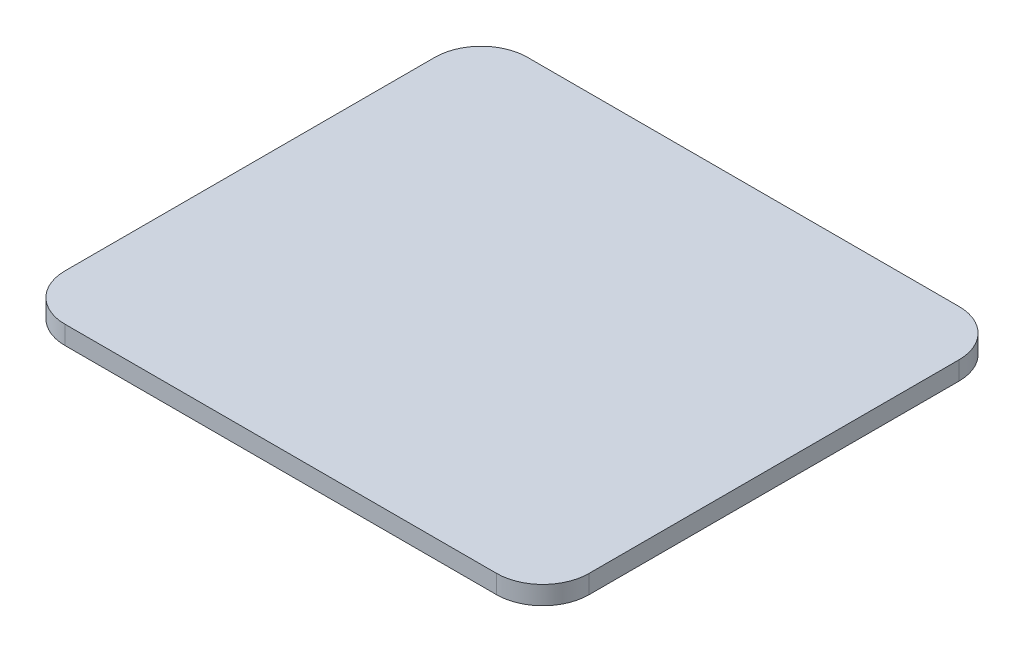
ISO-10303-21;
HEADER;
FILE_DESCRIPTION(('STEP AP214'),'2;1');
FILE_NAME('part.step','',(''),(''),'','','');
FILE_SCHEMA(('AUTOMOTIVE_DESIGN { 1 0 10303 214 1 1 1 1 }'));
ENDSEC;
DATA;
#1=APPLICATION_CONTEXT('core data for automotive mechanical design processes');
#2=APPLICATION_PROTOCOL_DEFINITION('international standard','automotive_design',2000,#1);
#3=PRODUCT_CONTEXT('',#1,'mechanical');
#4=PRODUCT('Part','Part','',(#3));
#5=PRODUCT_RELATED_PRODUCT_CATEGORY('part','',(#4));
#6=PRODUCT_DEFINITION_FORMATION('','',#4);
#7=PRODUCT_DEFINITION_CONTEXT('part definition',#1,'design');
#8=PRODUCT_DEFINITION('design','',#6,#7);
#9=PRODUCT_DEFINITION_SHAPE('','',#8);
#10=(LENGTH_UNIT() NAMED_UNIT(*) SI_UNIT(.MILLI.,.METRE.));
#11=(NAMED_UNIT(*) PLANE_ANGLE_UNIT() SI_UNIT($,.RADIAN.));
#12=(NAMED_UNIT(*) SI_UNIT($,.STERADIAN.) SOLID_ANGLE_UNIT());
#13=UNCERTAINTY_MEASURE_WITH_UNIT(LENGTH_MEASURE(1.E-05),#10,'distance_accuracy_value','');
#14=(GEOMETRIC_REPRESENTATION_CONTEXT(3) GLOBAL_UNCERTAINTY_ASSIGNED_CONTEXT((#13)) GLOBAL_UNIT_ASSIGNED_CONTEXT((#10,
#11,#12)) REPRESENTATION_CONTEXT('',''));
#15=CARTESIAN_POINT('',(0.,0.,0.));
#16=DIRECTION('',(0.,0.,1.));
#17=DIRECTION('',(1.,0.,0.));
#18=AXIS2_PLACEMENT_3D('',#15,#16,#17);
#19=CARTESIAN_POINT('',(170.,12.,150.));
#20=DIRECTION('',(-1.,0.,0.));
#21=DIRECTION('',(0.,0.,1.));
#22=AXIS2_PLACEMENT_3D('',#19,#20,#21);
#23=PLANE('',#22);
#24=DIRECTION('',(0.,0.,-1.));
#25=VECTOR('',#24,1.);
#26=CARTESIAN_POINT('',(170.,0.,150.));
#27=LINE('',#26,#25);
#28=CARTESIAN_POINT('',(170.,0.,120.));
#29=VERTEX_POINT('',#28);
#30=CARTESIAN_POINT('',(170.,0.,-120.));
#31=VERTEX_POINT('',#30);
#32=EDGE_CURVE('E129',#29,#31,#27,.T.);
#33=ORIENTED_EDGE('',*,*,#32,.T.);
#34=DIRECTION('',(0.,-1.,0.));
#35=VECTOR('',#34,1.);
#36=CARTESIAN_POINT('',(170.,12.,-120.));
#37=LINE('',#36,#35);
#38=CARTESIAN_POINT('',(170.,12.,-120.));
#39=VERTEX_POINT('',#38);
#40=EDGE_CURVE('E152',#31,#39,#37,.F.);
#41=ORIENTED_EDGE('',*,*,#40,.T.);
#42=DIRECTION('',(0.,0.,-1.));
#43=VECTOR('',#42,1.);
#44=CARTESIAN_POINT('',(170.,12.,150.));
#45=LINE('',#44,#43);
#46=CARTESIAN_POINT('',(170.,12.,120.));
#47=VERTEX_POINT('',#46);
#48=EDGE_CURVE('E127',#47,#39,#45,.T.);
#49=ORIENTED_EDGE('',*,*,#48,.F.);
#50=DIRECTION('',(0.,-1.,0.));
#51=VECTOR('',#50,1.);
#52=CARTESIAN_POINT('',(170.,12.,120.));
#53=LINE('',#52,#51);
#54=EDGE_CURVE('E149',#47,#29,#53,.T.);
#55=ORIENTED_EDGE('',*,*,#54,.T.);
#56=EDGE_LOOP('',(#33,#41,#49,#55));
#57=FACE_BOUND('',#56,.T.);
#58=ADVANCED_FACE('F34',(#57),#23,.F.);
#59=CARTESIAN_POINT('',(-170.,12.,-150.));
#60=DIRECTION('',(0.,0.,1.));
#61=DIRECTION('',(1.,0.,0.));
#62=AXIS2_PLACEMENT_3D('',#59,#60,#61);
#63=PLANE('',#62);
#64=DIRECTION('',(-1.,0.,0.));
#65=VECTOR('',#64,1.);
#66=CARTESIAN_POINT('',(-170.,0.,-150.));
#67=LINE('',#66,#65);
#68=CARTESIAN_POINT('',(140.,0.,-150.));
#69=VERTEX_POINT('',#68);
#70=CARTESIAN_POINT('',(-140.,0.,-150.));
#71=VERTEX_POINT('',#70);
#72=EDGE_CURVE('E125',#69,#71,#67,.T.);
#73=ORIENTED_EDGE('',*,*,#72,.T.);
#74=DIRECTION('',(0.,-1.,0.));
#75=VECTOR('',#74,1.);
#76=CARTESIAN_POINT('',(-140.,12.,-150.));
#77=LINE('',#76,#75);
#78=CARTESIAN_POINT('',(-140.,12.,-150.));
#79=VERTEX_POINT('',#78);
#80=EDGE_CURVE('E104',#71,#79,#77,.F.);
#81=ORIENTED_EDGE('',*,*,#80,.T.);
#82=DIRECTION('',(-1.,0.,0.));
#83=VECTOR('',#82,1.);
#84=CARTESIAN_POINT('',(-170.,12.,-150.));
#85=LINE('',#84,#83);
#86=CARTESIAN_POINT('',(140.,12.,-150.));
#87=VERTEX_POINT('',#86);
#88=EDGE_CURVE('E168',#87,#79,#85,.T.);
#89=ORIENTED_EDGE('',*,*,#88,.F.);
#90=DIRECTION('',(0.,-1.,0.));
#91=VECTOR('',#90,1.);
#92=CARTESIAN_POINT('',(140.,12.,-150.));
#93=LINE('',#92,#91);
#94=EDGE_CURVE('E109',#87,#69,#93,.T.);
#95=ORIENTED_EDGE('',*,*,#94,.T.);
#96=EDGE_LOOP('',(#73,#81,#89,#95));
#97=FACE_BOUND('',#96,.T.);
#98=ADVANCED_FACE('F185',(#97),#63,.F.);
#99=CARTESIAN_POINT('',(-170.,12.,150.));
#100=DIRECTION('',(1.,0.,0.));
#101=DIRECTION('',(0.,0.,-1.));
#102=AXIS2_PLACEMENT_3D('',#99,#100,#101);
#103=PLANE('',#102);
#104=DIRECTION('',(0.,0.,1.));
#105=VECTOR('',#104,1.);
#106=CARTESIAN_POINT('',(-170.,12.,150.));
#107=LINE('',#106,#105);
#108=CARTESIAN_POINT('',(-170.,12.,-120.));
#109=VERTEX_POINT('',#108);
#110=CARTESIAN_POINT('',(-170.,12.,120.));
#111=VERTEX_POINT('',#110);
#112=EDGE_CURVE('E118',#109,#111,#107,.T.);
#113=ORIENTED_EDGE('',*,*,#112,.F.);
#114=DIRECTION('',(0.,-1.,0.));
#115=VECTOR('',#114,1.);
#116=CARTESIAN_POINT('',(-170.,12.,-120.));
#117=LINE('',#116,#115);
#118=CARTESIAN_POINT('',(-170.,0.,-120.));
#119=VERTEX_POINT('',#118);
#120=EDGE_CURVE('E103',#109,#119,#117,.T.);
#121=ORIENTED_EDGE('',*,*,#120,.T.);
#122=DIRECTION('',(0.,0.,1.));
#123=VECTOR('',#122,1.);
#124=CARTESIAN_POINT('',(-170.,0.,150.));
#125=LINE('',#124,#123);
#126=CARTESIAN_POINT('',(-170.,0.,120.));
#127=VERTEX_POINT('',#126);
#128=EDGE_CURVE('E116',#119,#127,#125,.T.);
#129=ORIENTED_EDGE('',*,*,#128,.T.);
#130=DIRECTION('',(0.,-1.,0.));
#131=VECTOR('',#130,1.);
#132=CARTESIAN_POINT('',(-170.,12.,120.));
#133=LINE('',#132,#131);
#134=EDGE_CURVE('E120',#127,#111,#133,.F.);
#135=ORIENTED_EDGE('',*,*,#134,.T.);
#136=EDGE_LOOP('',(#113,#121,#129,#135));
#137=FACE_BOUND('',#136,.T.);
#138=ADVANCED_FACE('F115',(#137),#103,.F.);
#139=CARTESIAN_POINT('',(-170.,12.,150.));
#140=DIRECTION('',(0.,0.,-1.));
#141=DIRECTION('',(-1.,0.,0.));
#142=AXIS2_PLACEMENT_3D('',#139,#140,#141);
#143=PLANE('',#142);
#144=DIRECTION('',(1.,0.,0.));
#145=VECTOR('',#144,1.);
#146=CARTESIAN_POINT('',(-170.,0.,150.));
#147=LINE('',#146,#145);
#148=CARTESIAN_POINT('',(-140.,0.,150.));
#149=VERTEX_POINT('',#148);
#150=CARTESIAN_POINT('',(140.,0.,150.));
#151=VERTEX_POINT('',#150);
#152=EDGE_CURVE('E124',#149,#151,#147,.T.);
#153=ORIENTED_EDGE('',*,*,#152,.T.);
#154=DIRECTION('',(0.,-1.,0.));
#155=VECTOR('',#154,1.);
#156=CARTESIAN_POINT('',(140.,12.,150.));
#157=LINE('',#156,#155);
#158=CARTESIAN_POINT('',(140.,12.,150.));
#159=VERTEX_POINT('',#158);
#160=EDGE_CURVE('E11',#151,#159,#157,.F.);
#161=ORIENTED_EDGE('',*,*,#160,.T.);
#162=DIRECTION('',(1.,0.,0.));
#163=VECTOR('',#162,1.);
#164=CARTESIAN_POINT('',(-170.,12.,150.));
#165=LINE('',#164,#163);
#166=CARTESIAN_POINT('',(-140.,12.,150.));
#167=VERTEX_POINT('',#166);
#168=EDGE_CURVE('E133',#167,#159,#165,.T.);
#169=ORIENTED_EDGE('',*,*,#168,.F.);
#170=DIRECTION('',(0.,-1.,0.));
#171=VECTOR('',#170,1.);
#172=CARTESIAN_POINT('',(-140.,12.,150.));
#173=LINE('',#172,#171);
#174=EDGE_CURVE('E42',#167,#149,#173,.T.);
#175=ORIENTED_EDGE('',*,*,#174,.T.);
#176=EDGE_LOOP('',(#153,#161,#169,#175));
#177=FACE_BOUND('',#176,.T.);
#178=ADVANCED_FACE('F155',(#177),#143,.F.);
#179=CARTESIAN_POINT('',(0.,12.,0.));
#180=DIRECTION('',(0.,-1.,0.));
#181=DIRECTION('',(0.,0.,-1.));
#182=AXIS2_PLACEMENT_3D('',#179,#180,#181);
#183=PLANE('',#182);
#184=ORIENTED_EDGE('',*,*,#88,.T.);
#185=CARTESIAN_POINT('',(-140.,12.,-120.));
#186=DIRECTION('',(0.,-1.,0.));
#187=DIRECTION('',(0.,0.,-1.));
#188=AXIS2_PLACEMENT_3D('',#185,#186,#187);
#189=CIRCLE('',#188,30.);
#190=EDGE_CURVE('E147',#79,#109,#189,.F.);
#191=ORIENTED_EDGE('',*,*,#190,.T.);
#192=ORIENTED_EDGE('',*,*,#112,.T.);
#193=CARTESIAN_POINT('',(-140.,12.,120.));
#194=DIRECTION('',(0.,-1.,0.));
#195=DIRECTION('',(0.,0.,-1.));
#196=AXIS2_PLACEMENT_3D('',#193,#194,#195);
#197=CIRCLE('',#196,30.);
#198=EDGE_CURVE('E54',#111,#167,#197,.F.);
#199=ORIENTED_EDGE('',*,*,#198,.T.);
#200=ORIENTED_EDGE('',*,*,#168,.T.);
#201=CARTESIAN_POINT('',(140.,12.,120.));
#202=DIRECTION('',(0.,-1.,0.));
#203=DIRECTION('',(0.,0.,-1.));
#204=AXIS2_PLACEMENT_3D('',#201,#202,#203);
#205=CIRCLE('',#204,30.);
#206=EDGE_CURVE('E143',#159,#47,#205,.F.);
#207=ORIENTED_EDGE('',*,*,#206,.T.);
#208=ORIENTED_EDGE('',*,*,#48,.T.);
#209=CARTESIAN_POINT('',(140.,12.,-120.));
#210=DIRECTION('',(0.,-1.,0.));
#211=DIRECTION('',(0.,0.,-1.));
#212=AXIS2_PLACEMENT_3D('',#209,#210,#211);
#213=CIRCLE('',#212,30.);
#214=EDGE_CURVE('E145',#39,#87,#213,.F.);
#215=ORIENTED_EDGE('',*,*,#214,.T.);
#216=EDGE_LOOP('',(#184,#191,#192,#199,#200,#207,#208,#215));
#217=FACE_BOUND('',#216,.T.);
#218=ADVANCED_FACE('F174',(#217),#183,.F.);
#219=CARTESIAN_POINT('',(0.,0.,0.));
#220=DIRECTION('',(0.,-1.,0.));
#221=DIRECTION('',(0.,0.,-1.));
#222=AXIS2_PLACEMENT_3D('',#219,#220,#221);
#223=PLANE('',#222);
#224=ORIENTED_EDGE('',*,*,#128,.F.);
#225=CARTESIAN_POINT('',(-140.,0.,-120.));
#226=DIRECTION('',(0.,-1.,0.));
#227=DIRECTION('',(0.,0.,-1.));
#228=AXIS2_PLACEMENT_3D('',#225,#226,#227);
#229=CIRCLE('',#228,30.);
#230=EDGE_CURVE('E99',#119,#71,#229,.T.);
#231=ORIENTED_EDGE('',*,*,#230,.T.);
#232=ORIENTED_EDGE('',*,*,#72,.F.);
#233=CARTESIAN_POINT('',(140.,0.,-120.));
#234=DIRECTION('',(0.,-1.,0.));
#235=DIRECTION('',(0.,0.,-1.));
#236=AXIS2_PLACEMENT_3D('',#233,#234,#235);
#237=CIRCLE('',#236,30.);
#238=EDGE_CURVE('E110',#69,#31,#237,.T.);
#239=ORIENTED_EDGE('',*,*,#238,.T.);
#240=ORIENTED_EDGE('',*,*,#32,.F.);
#241=CARTESIAN_POINT('',(140.,0.,120.));
#242=DIRECTION('',(0.,-1.,0.));
#243=DIRECTION('',(0.,0.,-1.));
#244=AXIS2_PLACEMENT_3D('',#241,#242,#243);
#245=CIRCLE('',#244,30.);
#246=EDGE_CURVE('E136',#29,#151,#245,.T.);
#247=ORIENTED_EDGE('',*,*,#246,.T.);
#248=ORIENTED_EDGE('',*,*,#152,.F.);
#249=CARTESIAN_POINT('',(-140.,0.,120.));
#250=DIRECTION('',(0.,-1.,0.));
#251=DIRECTION('',(0.,0.,-1.));
#252=AXIS2_PLACEMENT_3D('',#249,#250,#251);
#253=CIRCLE('',#252,30.);
#254=EDGE_CURVE('E119',#149,#127,#253,.T.);
#255=ORIENTED_EDGE('',*,*,#254,.T.);
#256=EDGE_LOOP('',(#224,#231,#232,#239,#240,#247,#248,#255));
#257=FACE_BOUND('',#256,.T.);
#258=ADVANCED_FACE('F122',(#257),#223,.T.);
#259=CARTESIAN_POINT('',(-140.,12.,-120.));
#260=DIRECTION('',(0.,-1.,0.));
#261=DIRECTION('',(0.,0.,-1.));
#262=AXIS2_PLACEMENT_3D('',#259,#260,#261);
#263=CYLINDRICAL_SURFACE('',#262,30.);
#264=ORIENTED_EDGE('',*,*,#190,.F.);
#265=ORIENTED_EDGE('',*,*,#80,.F.);
#266=ORIENTED_EDGE('',*,*,#230,.F.);
#267=ORIENTED_EDGE('',*,*,#120,.F.);
#268=EDGE_LOOP('',(#264,#265,#266,#267));
#269=FACE_BOUND('',#268,.T.);
#270=ADVANCED_FACE('F102',(#269),#263,.T.);
#271=CARTESIAN_POINT('',(140.,12.,-120.));
#272=DIRECTION('',(0.,-1.,0.));
#273=DIRECTION('',(0.,0.,-1.));
#274=AXIS2_PLACEMENT_3D('',#271,#272,#273);
#275=CYLINDRICAL_SURFACE('',#274,30.);
#276=ORIENTED_EDGE('',*,*,#214,.F.);
#277=ORIENTED_EDGE('',*,*,#40,.F.);
#278=ORIENTED_EDGE('',*,*,#238,.F.);
#279=ORIENTED_EDGE('',*,*,#94,.F.);
#280=EDGE_LOOP('',(#276,#277,#278,#279));
#281=FACE_BOUND('',#280,.T.);
#282=ADVANCED_FACE('F196',(#281),#275,.T.);
#283=CARTESIAN_POINT('',(140.,12.,120.));
#284=DIRECTION('',(0.,-1.,0.));
#285=DIRECTION('',(0.,0.,-1.));
#286=AXIS2_PLACEMENT_3D('',#283,#284,#285);
#287=CYLINDRICAL_SURFACE('',#286,30.);
#288=ORIENTED_EDGE('',*,*,#206,.F.);
#289=ORIENTED_EDGE('',*,*,#160,.F.);
#290=ORIENTED_EDGE('',*,*,#246,.F.);
#291=ORIENTED_EDGE('',*,*,#54,.F.);
#292=EDGE_LOOP('',(#288,#289,#290,#291));
#293=FACE_BOUND('',#292,.T.);
#294=ADVANCED_FACE('F162',(#293),#287,.T.);
#295=CARTESIAN_POINT('',(-140.,12.,120.));
#296=DIRECTION('',(0.,-1.,0.));
#297=DIRECTION('',(0.,0.,-1.));
#298=AXIS2_PLACEMENT_3D('',#295,#296,#297);
#299=CYLINDRICAL_SURFACE('',#298,30.);
#300=ORIENTED_EDGE('',*,*,#198,.F.);
#301=ORIENTED_EDGE('',*,*,#134,.F.);
#302=ORIENTED_EDGE('',*,*,#254,.F.);
#303=ORIENTED_EDGE('',*,*,#174,.F.);
#304=EDGE_LOOP('',(#300,#301,#302,#303));
#305=FACE_BOUND('',#304,.T.);
#306=ADVANCED_FACE('F36',(#305),#299,.T.);
#307=CLOSED_SHELL('',(#58,#98,#138,#178,#218,#258,#270,#282,#294,#306));
#308=MANIFOLD_SOLID_BREP('B2',#307);
#309=ADVANCED_BREP_SHAPE_REPRESENTATION('',(#18,#308),#14);
#310=SHAPE_DEFINITION_REPRESENTATION(#9,#309);
ENDSEC;
END-ISO-10303-21;
